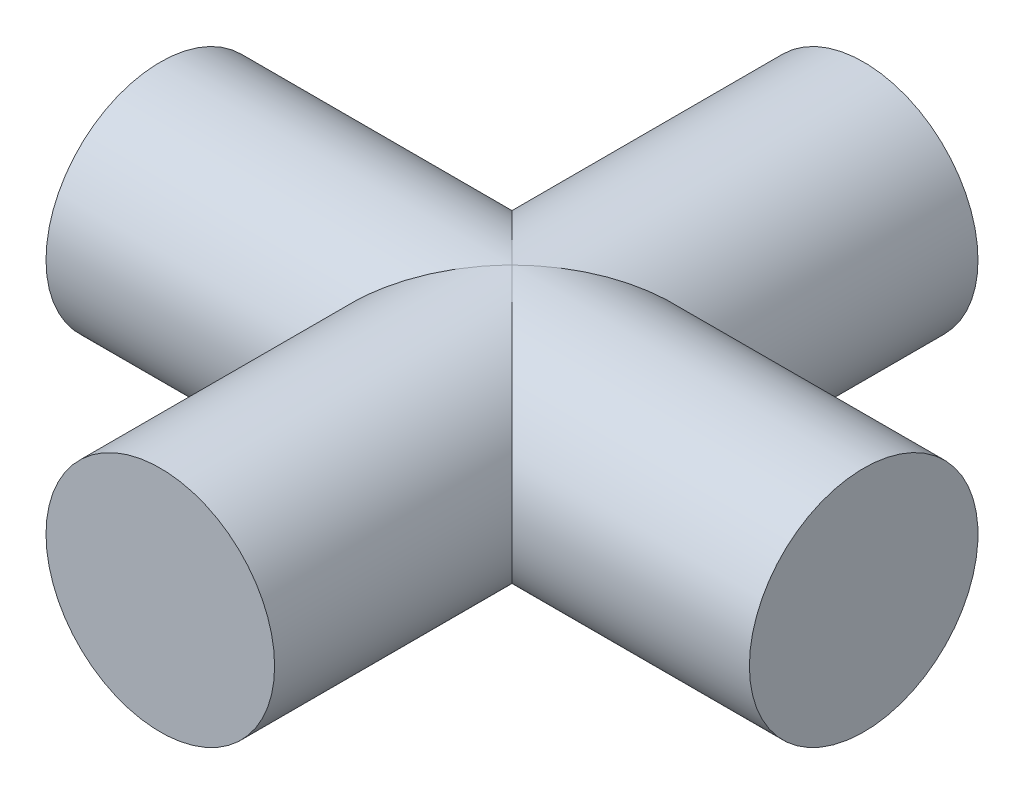
ISO-10303-21;
HEADER;
FILE_DESCRIPTION(('STEP AP214'),'2;1');
FILE_NAME('part.step','',(''),(''),'','','');
FILE_SCHEMA(('AUTOMOTIVE_DESIGN { 1 0 10303 214 1 1 1 1 }'));
ENDSEC;
DATA;
#1=APPLICATION_CONTEXT('core data for automotive mechanical design processes');
#2=APPLICATION_PROTOCOL_DEFINITION('international standard','automotive_design',2000,#1);
#3=PRODUCT_CONTEXT('',#1,'mechanical');
#4=PRODUCT('Part','Part','',(#3));
#5=PRODUCT_RELATED_PRODUCT_CATEGORY('part','',(#4));
#6=PRODUCT_DEFINITION_FORMATION('','',#4);
#7=PRODUCT_DEFINITION_CONTEXT('part definition',#1,'design');
#8=PRODUCT_DEFINITION('design','',#6,#7);
#9=PRODUCT_DEFINITION_SHAPE('','',#8);
#10=(LENGTH_UNIT() NAMED_UNIT(*) SI_UNIT(.MILLI.,.METRE.));
#11=(NAMED_UNIT(*) PLANE_ANGLE_UNIT() SI_UNIT($,.RADIAN.));
#12=(NAMED_UNIT(*) SI_UNIT($,.STERADIAN.) SOLID_ANGLE_UNIT());
#13=UNCERTAINTY_MEASURE_WITH_UNIT(LENGTH_MEASURE(1.E-05),#10,'distance_accuracy_value','');
#14=(GEOMETRIC_REPRESENTATION_CONTEXT(3) GLOBAL_UNCERTAINTY_ASSIGNED_CONTEXT((#13)) GLOBAL_UNIT_ASSIGNED_CONTEXT((#10,
#11,#12)) REPRESENTATION_CONTEXT('',''));
#15=CARTESIAN_POINT('',(0.,0.,0.));
#16=DIRECTION('',(0.,0.,1.));
#17=DIRECTION('',(1.,0.,0.));
#18=AXIS2_PLACEMENT_3D('',#15,#16,#17);
#19=CARTESIAN_POINT('',(20.,43.,0.));
#20=DIRECTION('',(-1.,0.,0.));
#21=DIRECTION('',(0.,0.,1.));
#22=AXIS2_PLACEMENT_3D('',#19,#20,#21);
#23=CYLINDRICAL_SURFACE('',#22,6.49999999999999);
#24=CARTESIAN_POINT('',(-20.,43.,0.));
#25=DIRECTION('',(-1.,0.,0.));
#26=DIRECTION('',(0.,0.,1.));
#27=AXIS2_PLACEMENT_3D('',#24,#25,#26);
#28=CIRCLE('',#27,6.49999999999999);
#29=CARTESIAN_POINT('',(-20.,43.,6.49999999999999));
#30=VERTEX_POINT('',#29);
#31=EDGE_CURVE('E70',#30,#30,#28,.T.);
#32=ORIENTED_EDGE('',*,*,#31,.F.);
#33=EDGE_LOOP('',(#32));
#34=FACE_BOUND('',#33,.T.);
#35=CARTESIAN_POINT('',(0.,43.,0.));
#36=DIRECTION('',(-0.707106781186547,0.,0.707106781186547));
#37=DIRECTION('',(-0.707106781186547,0.,-0.707106781186547));
#38=AXIS2_PLACEMENT_3D('',#35,#36,#37);
#39=ELLIPSE('',#38,9.19238815542511,6.49999999999999);
#40=CARTESIAN_POINT('',(0.,49.5,0.));
#41=VERTEX_POINT('',#40);
#42=CARTESIAN_POINT('',(0.,36.5,0.));
#43=VERTEX_POINT('',#42);
#44=EDGE_CURVE('E58',#41,#43,#39,.T.);
#45=ORIENTED_EDGE('',*,*,#44,.T.);
#46=CARTESIAN_POINT('',(0.,43.,0.));
#47=DIRECTION('',(-0.707106781186547,0.,-0.707106781186547));
#48=DIRECTION('',(-0.707106781186547,0.,0.707106781186547));
#49=AXIS2_PLACEMENT_3D('',#46,#47,#48);
#50=ELLIPSE('',#49,9.19238815542511,6.49999999999999);
#51=EDGE_CURVE('E47',#43,#41,#50,.T.);
#52=ORIENTED_EDGE('',*,*,#51,.T.);
#53=EDGE_LOOP('',(#45,#52));
#54=FACE_BOUND('',#53,.T.);
#55=ADVANCED_FACE('F39',(#34,#54),#23,.T.);
#56=CARTESIAN_POINT('',(-20.,43.,0.));
#57=DIRECTION('',(-1.,0.,0.));
#58=DIRECTION('',(0.,0.,1.));
#59=AXIS2_PLACEMENT_3D('',#56,#57,#58);
#60=PLANE('',#59);
#61=ORIENTED_EDGE('',*,*,#31,.T.);
#62=EDGE_LOOP('',(#61));
#63=FACE_BOUND('',#62,.T.);
#64=ADVANCED_FACE('F91',(#63),#60,.T.);
#65=CARTESIAN_POINT('',(0.,43.,20.));
#66=DIRECTION('',(0.,0.,1.));
#67=DIRECTION('',(1.,0.,0.));
#68=AXIS2_PLACEMENT_3D('',#65,#66,#67);
#69=PLANE('',#68);
#70=CARTESIAN_POINT('',(0.,43.,20.));
#71=DIRECTION('',(0.,0.,1.));
#72=DIRECTION('',(1.,0.,0.));
#73=AXIS2_PLACEMENT_3D('',#70,#71,#72);
#74=CIRCLE('',#73,6.49999999999999);
#75=CARTESIAN_POINT('',(6.5,43.,20.));
#76=VERTEX_POINT('',#75);
#77=EDGE_CURVE('E73',#76,#76,#74,.T.);
#78=ORIENTED_EDGE('',*,*,#77,.T.);
#79=EDGE_LOOP('',(#78));
#80=FACE_BOUND('',#79,.T.);
#81=ADVANCED_FACE('F82',(#80),#69,.T.);
#82=CARTESIAN_POINT('',(0.,43.,20.));
#83=DIRECTION('',(0.,0.,-1.));
#84=DIRECTION('',(-1.,0.,0.));
#85=AXIS2_PLACEMENT_3D('',#82,#83,#84);
#86=CYLINDRICAL_SURFACE('',#85,6.49999999999999);
#87=ORIENTED_EDGE('',*,*,#51,.F.);
#88=CARTESIAN_POINT('',(0.,43.,0.));
#89=DIRECTION('',(-0.707106781186547,0.,0.707106781186547));
#90=DIRECTION('',(-0.707106781186547,0.,-0.707106781186547));
#91=AXIS2_PLACEMENT_3D('',#88,#89,#90);
#92=ELLIPSE('',#91,9.19238815542511,6.49999999999999);
#93=EDGE_CURVE('E52',#41,#43,#92,.F.);
#94=ORIENTED_EDGE('',*,*,#93,.F.);
#95=EDGE_LOOP('',(#87,#94));
#96=FACE_BOUND('',#95,.T.);
#97=ORIENTED_EDGE('',*,*,#77,.F.);
#98=EDGE_LOOP('',(#97));
#99=FACE_BOUND('',#98,.T.);
#100=ADVANCED_FACE('F65',(#96,#99),#86,.T.);
#101=CARTESIAN_POINT('',(0.,43.,0.));
#102=DIRECTION('',(-0.707106781186547,0.,-0.707106781186547));
#103=DIRECTION('',(-0.707106781186547,0.,0.707106781186547));
#104=AXIS2_PLACEMENT_3D('',#101,#102,#103);
#105=ELLIPSE('',#104,9.19238815542511,6.49999999999999);
#106=EDGE_CURVE('E11',#43,#41,#105,.F.);
#107=ORIENTED_EDGE('',*,*,#106,.F.);
#108=ORIENTED_EDGE('',*,*,#44,.F.);
#109=EDGE_LOOP('',(#107,#108));
#110=FACE_BOUND('',#109,.T.);
#111=CARTESIAN_POINT('',(0.,43.,-20.));
#112=DIRECTION('',(0.,0.,1.));
#113=DIRECTION('',(1.,0.,0.));
#114=AXIS2_PLACEMENT_3D('',#111,#112,#113);
#115=CIRCLE('',#114,6.49999999999999);
#116=CARTESIAN_POINT('',(6.5,43.,-20.));
#117=VERTEX_POINT('',#116);
#118=EDGE_CURVE('E76',#117,#117,#115,.T.);
#119=ORIENTED_EDGE('',*,*,#118,.T.);
#120=EDGE_LOOP('',(#119));
#121=FACE_BOUND('',#120,.T.);
#122=ADVANCED_FACE('F59',(#110,#121),#86,.T.);
#123=CARTESIAN_POINT('',(0.,43.,-20.));
#124=DIRECTION('',(0.,0.,1.));
#125=DIRECTION('',(1.,0.,0.));
#126=AXIS2_PLACEMENT_3D('',#123,#124,#125);
#127=PLANE('',#126);
#128=ORIENTED_EDGE('',*,*,#118,.F.);
#129=EDGE_LOOP('',(#128));
#130=FACE_BOUND('',#129,.T.);
#131=ADVANCED_FACE('F90',(#130),#127,.F.);
#132=CARTESIAN_POINT('',(20.,43.,0.));
#133=DIRECTION('',(-1.,0.,0.));
#134=DIRECTION('',(0.,0.,1.));
#135=AXIS2_PLACEMENT_3D('',#132,#133,#134);
#136=PLANE('',#135);
#137=CARTESIAN_POINT('',(20.,43.,0.));
#138=DIRECTION('',(-1.,0.,0.));
#139=DIRECTION('',(0.,0.,1.));
#140=AXIS2_PLACEMENT_3D('',#137,#138,#139);
#141=CIRCLE('',#140,6.49999999999999);
#142=CARTESIAN_POINT('',(20.,43.,6.49999999999999));
#143=VERTEX_POINT('',#142);
#144=EDGE_CURVE('E67',#143,#143,#141,.T.);
#145=ORIENTED_EDGE('',*,*,#144,.F.);
#146=EDGE_LOOP('',(#145));
#147=FACE_BOUND('',#146,.T.);
#148=ADVANCED_FACE('F104',(#147),#136,.F.);
#149=ORIENTED_EDGE('',*,*,#144,.T.);
#150=EDGE_LOOP('',(#149));
#151=FACE_BOUND('',#150,.T.);
#152=ORIENTED_EDGE('',*,*,#93,.T.);
#153=ORIENTED_EDGE('',*,*,#106,.T.);
#154=EDGE_LOOP('',(#152,#153));
#155=FACE_BOUND('',#154,.T.);
#156=ADVANCED_FACE('F41',(#151,#155),#23,.T.);
#157=CLOSED_SHELL('',(#55,#64,#81,#100,#122,#131,#148,#156));
#158=MANIFOLD_SOLID_BREP('B2',#157);
#159=ADVANCED_BREP_SHAPE_REPRESENTATION('',(#18,#158),#14);
#160=SHAPE_DEFINITION_REPRESENTATION(#9,#159);
ENDSEC;
END-ISO-10303-21;
